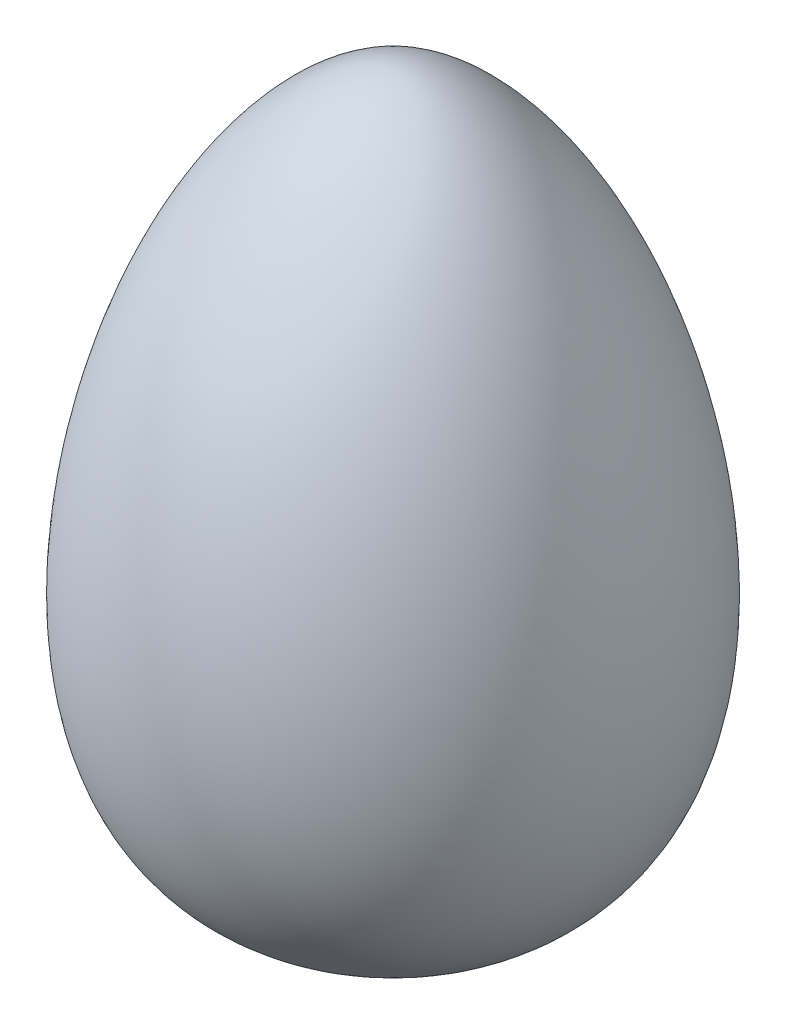
ISO-10303-21;
HEADER;
FILE_DESCRIPTION(('STEP AP214'),'2;1');
FILE_NAME('part.step','',(''),(''),'','','');
FILE_SCHEMA(('AUTOMOTIVE_DESIGN { 1 0 10303 214 1 1 1 1 }'));
ENDSEC;
DATA;
#1=APPLICATION_CONTEXT('core data for automotive mechanical design processes');
#2=APPLICATION_PROTOCOL_DEFINITION('international standard','automotive_design',2000,#1);
#3=PRODUCT_CONTEXT('',#1,'mechanical');
#4=PRODUCT('Part','Part','',(#3));
#5=PRODUCT_RELATED_PRODUCT_CATEGORY('part','',(#4));
#6=PRODUCT_DEFINITION_FORMATION('','',#4);
#7=PRODUCT_DEFINITION_CONTEXT('part definition',#1,'design');
#8=PRODUCT_DEFINITION('design','',#6,#7);
#9=PRODUCT_DEFINITION_SHAPE('','',#8);
#10=(LENGTH_UNIT() NAMED_UNIT(*) SI_UNIT(.MILLI.,.METRE.));
#11=(NAMED_UNIT(*) PLANE_ANGLE_UNIT() SI_UNIT($,.RADIAN.));
#12=(NAMED_UNIT(*) SI_UNIT($,.STERADIAN.) SOLID_ANGLE_UNIT());
#13=UNCERTAINTY_MEASURE_WITH_UNIT(LENGTH_MEASURE(1.E-05),#10,'distance_accuracy_value','');
#14=(GEOMETRIC_REPRESENTATION_CONTEXT(3) GLOBAL_UNCERTAINTY_ASSIGNED_CONTEXT((#13)) GLOBAL_UNIT_ASSIGNED_CONTEXT((#10,
#11,#12)) REPRESENTATION_CONTEXT('',''));
#15=CARTESIAN_POINT('',(0.,0.,0.));
#16=DIRECTION('',(0.,0.,1.));
#17=DIRECTION('',(1.,0.,0.));
#18=AXIS2_PLACEMENT_3D('',#15,#16,#17);
#19=CARTESIAN_POINT('',(0.,31.5,0.));
#20=CARTESIAN_POINT('',(-6.45,31.5,0.));
#21=CARTESIAN_POINT('',(-17.3141358074274,19.7453597087304,0.));
#22=CARTESIAN_POINT('',(-23.3030537360273,-13.1083038983101,0.));
#23=CARTESIAN_POINT('',(-18.8979835394536,-31.776076334638,0.));
#24=CARTESIAN_POINT('',(2.17939892817128E-13,-31.5,0.));
#25=B_SPLINE_CURVE_WITH_KNOTS('',3,(#19,#20,#21,#22,#23,#24),.UNSPECIFIED.,.F.,.F.,(4,1,1,4),
(0.,0.524773133871435,0.624773133871435,1.),.UNSPECIFIED.);
#26=CARTESIAN_POINT('',(0.,31.5,0.));
#27=DIRECTION('',(0.,1.,0.));
#28=AXIS1_PLACEMENT('',#26,#27);
#29=SURFACE_OF_REVOLUTION('',#25,#28);
#30=CARTESIAN_POINT('',(0.,-31.5,0.));
#31=VERTEX_POINT('',#30);
#32=VERTEX_LOOP('',#31);
#33=FACE_BOUND('',#32,.T.);
#34=CARTESIAN_POINT('',(0.,31.5,0.));
#35=VERTEX_POINT('',#34);
#36=VERTEX_LOOP('',#35);
#37=FACE_BOUND('',#36,.T.);
#38=ADVANCED_FACE('F35',(#33,#37),#29,.F.);
#39=CLOSED_SHELL('',(#38));
#40=MANIFOLD_SOLID_BREP('B2',#39);
#41=ADVANCED_BREP_SHAPE_REPRESENTATION('',(#18,#40),#14);
#42=SHAPE_DEFINITION_REPRESENTATION(#9,#41);
ENDSEC;
END-ISO-10303-21;
